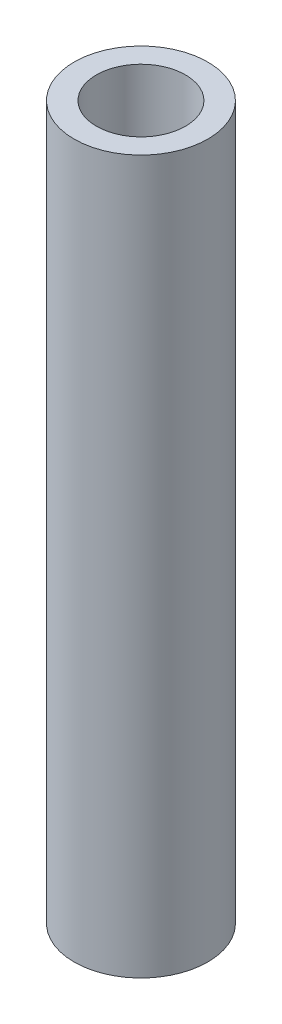
ISO-10303-21;
HEADER;
FILE_DESCRIPTION(('STEP AP214'),'2;1');
FILE_NAME('part.step','',(''),(''),'','','');
FILE_SCHEMA(('AUTOMOTIVE_DESIGN { 1 0 10303 214 1 1 1 1 }'));
ENDSEC;
DATA;
#1=APPLICATION_CONTEXT('core data for automotive mechanical design processes');
#2=APPLICATION_PROTOCOL_DEFINITION('international standard','automotive_design',2000,#1);
#3=PRODUCT_CONTEXT('',#1,'mechanical');
#4=PRODUCT('Part','Part','',(#3));
#5=PRODUCT_RELATED_PRODUCT_CATEGORY('part','',(#4));
#6=PRODUCT_DEFINITION_FORMATION('','',#4);
#7=PRODUCT_DEFINITION_CONTEXT('part definition',#1,'design');
#8=PRODUCT_DEFINITION('design','',#6,#7);
#9=PRODUCT_DEFINITION_SHAPE('','',#8);
#10=(LENGTH_UNIT() NAMED_UNIT(*) SI_UNIT(.MILLI.,.METRE.));
#11=(NAMED_UNIT(*) PLANE_ANGLE_UNIT() SI_UNIT($,.RADIAN.));
#12=(NAMED_UNIT(*) SI_UNIT($,.STERADIAN.) SOLID_ANGLE_UNIT());
#13=UNCERTAINTY_MEASURE_WITH_UNIT(LENGTH_MEASURE(1.E-05),#10,'distance_accuracy_value','');
#14=(GEOMETRIC_REPRESENTATION_CONTEXT(3) GLOBAL_UNCERTAINTY_ASSIGNED_CONTEXT((#13)) GLOBAL_UNIT_ASSIGNED_CONTEXT((#10,
#11,#12)) REPRESENTATION_CONTEXT('',''));
#15=CARTESIAN_POINT('',(0.,0.,0.));
#16=DIRECTION('',(0.,0.,1.));
#17=DIRECTION('',(1.,0.,0.));
#18=AXIS2_PLACEMENT_3D('',#15,#16,#17);
#19=CARTESIAN_POINT('',(0.,101.6,0.));
#20=DIRECTION('',(0.,1.,0.));
#21=DIRECTION('',(0.,0.,1.));
#22=AXIS2_PLACEMENT_3D('',#19,#20,#21);
#23=PLANE('',#22);
#24=CARTESIAN_POINT('',(0.,101.6,0.));
#25=DIRECTION('',(0.,1.,0.));
#26=DIRECTION('',(0.,0.,1.));
#27=AXIS2_PLACEMENT_3D('',#24,#25,#26);
#28=CIRCLE('',#27,9.525);
#29=CARTESIAN_POINT('',(0.,101.6,9.525));
#30=VERTEX_POINT('',#29);
#31=EDGE_CURVE('E10',#30,#30,#28,.T.);
#32=ORIENTED_EDGE('',*,*,#31,.T.);
#33=EDGE_LOOP('',(#32));
#34=FACE_BOUND('',#33,.T.);
#35=CARTESIAN_POINT('',(0.,101.6,0.));
#36=DIRECTION('',(0.,1.,0.));
#37=DIRECTION('',(0.,0.,1.));
#38=AXIS2_PLACEMENT_3D('',#35,#36,#37);
#39=CIRCLE('',#38,6.35);
#40=CARTESIAN_POINT('',(0.,101.6,6.35));
#41=VERTEX_POINT('',#40);
#42=EDGE_CURVE('E50',#41,#41,#39,.T.);
#43=ORIENTED_EDGE('',*,*,#42,.F.);
#44=EDGE_LOOP('',(#43));
#45=FACE_BOUND('',#44,.T.);
#46=ADVANCED_FACE('F37',(#34,#45),#23,.T.);
#47=CARTESIAN_POINT('',(0.,0.,0.));
#48=DIRECTION('',(0.,1.,0.));
#49=DIRECTION('',(0.,0.,1.));
#50=AXIS2_PLACEMENT_3D('',#47,#48,#49);
#51=PLANE('',#50);
#52=CARTESIAN_POINT('',(0.,0.,0.));
#53=DIRECTION('',(0.,1.,0.));
#54=DIRECTION('',(0.,0.,1.));
#55=AXIS2_PLACEMENT_3D('',#52,#53,#54);
#56=CIRCLE('',#55,9.525);
#57=CARTESIAN_POINT('',(0.,0.,9.525));
#58=VERTEX_POINT('',#57);
#59=EDGE_CURVE('E41',#58,#58,#56,.T.);
#60=ORIENTED_EDGE('',*,*,#59,.F.);
#61=EDGE_LOOP('',(#60));
#62=FACE_BOUND('',#61,.T.);
#63=CARTESIAN_POINT('',(0.,0.,0.));
#64=DIRECTION('',(0.,1.,0.));
#65=DIRECTION('',(0.,0.,1.));
#66=AXIS2_PLACEMENT_3D('',#63,#64,#65);
#67=CIRCLE('',#66,6.35);
#68=CARTESIAN_POINT('',(0.,0.,6.35));
#69=VERTEX_POINT('',#68);
#70=EDGE_CURVE('E52',#69,#69,#67,.T.);
#71=ORIENTED_EDGE('',*,*,#70,.T.);
#72=EDGE_LOOP('',(#71));
#73=FACE_BOUND('',#72,.T.);
#74=ADVANCED_FACE('F64',(#62,#73),#51,.F.);
#75=CARTESIAN_POINT('',(0.,101.6,0.));
#76=DIRECTION('',(0.,-1.,0.));
#77=DIRECTION('',(0.,0.,-1.));
#78=AXIS2_PLACEMENT_3D('',#75,#76,#77);
#79=CYLINDRICAL_SURFACE('',#78,9.525);
#80=ORIENTED_EDGE('',*,*,#31,.F.);
#81=EDGE_LOOP('',(#80));
#82=FACE_BOUND('',#81,.T.);
#83=ORIENTED_EDGE('',*,*,#59,.T.);
#84=EDGE_LOOP('',(#83));
#85=FACE_BOUND('',#84,.T.);
#86=ADVANCED_FACE('F39',(#82,#85),#79,.T.);
#87=CARTESIAN_POINT('',(0.,101.6,0.));
#88=DIRECTION('',(0.,-1.,0.));
#89=DIRECTION('',(0.,0.,-1.));
#90=AXIS2_PLACEMENT_3D('',#87,#88,#89);
#91=CYLINDRICAL_SURFACE('',#90,6.35);
#92=ORIENTED_EDGE('',*,*,#42,.T.);
#93=EDGE_LOOP('',(#92));
#94=FACE_BOUND('',#93,.T.);
#95=ORIENTED_EDGE('',*,*,#70,.F.);
#96=EDGE_LOOP('',(#95));
#97=FACE_BOUND('',#96,.T.);
#98=ADVANCED_FACE('F60',(#94,#97),#91,.F.);
#99=CLOSED_SHELL('',(#46,#74,#86,#98));
#100=MANIFOLD_SOLID_BREP('B2',#99);
#101=ADVANCED_BREP_SHAPE_REPRESENTATION('',(#18,#100),#14);
#102=SHAPE_DEFINITION_REPRESENTATION(#9,#101);
ENDSEC;
END-ISO-10303-21;
